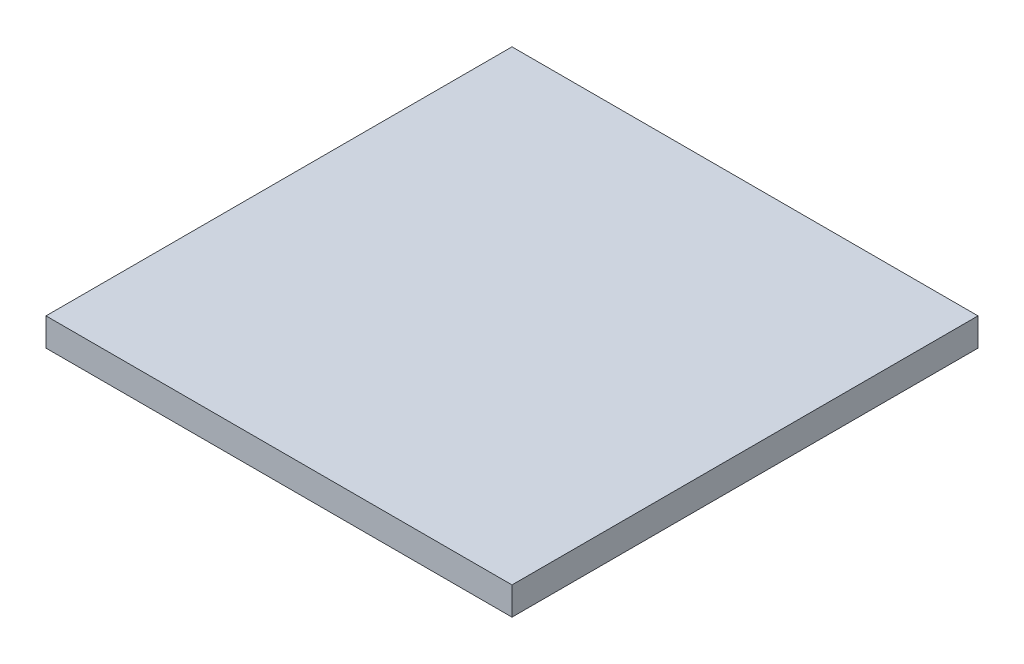
ISO-10303-21;
HEADER;
FILE_DESCRIPTION(('STEP AP214'),'2;1');
FILE_NAME('part.step','',(''),(''),'','','');
FILE_SCHEMA(('AUTOMOTIVE_DESIGN { 1 0 10303 214 1 1 1 1 }'));
ENDSEC;
DATA;
#1=APPLICATION_CONTEXT('core data for automotive mechanical design processes');
#2=APPLICATION_PROTOCOL_DEFINITION('international standard','automotive_design',2000,#1);
#3=PRODUCT_CONTEXT('',#1,'mechanical');
#4=PRODUCT('Part','Part','',(#3));
#5=PRODUCT_RELATED_PRODUCT_CATEGORY('part','',(#4));
#6=PRODUCT_DEFINITION_FORMATION('','',#4);
#7=PRODUCT_DEFINITION_CONTEXT('part definition',#1,'design');
#8=PRODUCT_DEFINITION('design','',#6,#7);
#9=PRODUCT_DEFINITION_SHAPE('','',#8);
#10=(LENGTH_UNIT() NAMED_UNIT(*) SI_UNIT(.MILLI.,.METRE.));
#11=(NAMED_UNIT(*) PLANE_ANGLE_UNIT() SI_UNIT($,.RADIAN.));
#12=(NAMED_UNIT(*) SI_UNIT($,.STERADIAN.) SOLID_ANGLE_UNIT());
#13=UNCERTAINTY_MEASURE_WITH_UNIT(LENGTH_MEASURE(1.E-05),#10,'distance_accuracy_value','');
#14=(GEOMETRIC_REPRESENTATION_CONTEXT(3) GLOBAL_UNCERTAINTY_ASSIGNED_CONTEXT((#13)) GLOBAL_UNIT_ASSIGNED_CONTEXT((#10,
#11,#12)) REPRESENTATION_CONTEXT('',''));
#15=CARTESIAN_POINT('',(0.,0.,0.));
#16=DIRECTION('',(0.,0.,1.));
#17=DIRECTION('',(1.,0.,0.));
#18=AXIS2_PLACEMENT_3D('',#15,#16,#17);
#19=CARTESIAN_POINT('',(-250.,30.,-250.));
#20=DIRECTION('',(1.,0.,0.));
#21=DIRECTION('',(0.,0.,-1.));
#22=AXIS2_PLACEMENT_3D('',#19,#20,#21);
#23=PLANE('',#22);
#24=DIRECTION('',(0.,0.,1.));
#25=VECTOR('',#24,1.);
#26=CARTESIAN_POINT('',(-250.,0.,-250.));
#27=LINE('',#26,#25);
#28=CARTESIAN_POINT('',(-250.,0.,-250.));
#29=VERTEX_POINT('',#28);
#30=CARTESIAN_POINT('',(-250.,0.,250.));
#31=VERTEX_POINT('',#30);
#32=EDGE_CURVE('E96',#29,#31,#27,.T.);
#33=ORIENTED_EDGE('',*,*,#32,.T.);
#34=DIRECTION('',(0.,-1.,0.));
#35=VECTOR('',#34,1.);
#36=CARTESIAN_POINT('',(-250.,30.,250.));
#37=LINE('',#36,#35);
#38=CARTESIAN_POINT('',(-250.,30.,250.));
#39=VERTEX_POINT('',#38);
#40=EDGE_CURVE('E11',#39,#31,#37,.T.);
#41=ORIENTED_EDGE('',*,*,#40,.F.);
#42=DIRECTION('',(0.,0.,1.));
#43=VECTOR('',#42,1.);
#44=CARTESIAN_POINT('',(-250.,30.,-250.));
#45=LINE('',#44,#43);
#46=CARTESIAN_POINT('',(-250.,30.,-250.));
#47=VERTEX_POINT('',#46);
#48=EDGE_CURVE('E84',#47,#39,#45,.T.);
#49=ORIENTED_EDGE('',*,*,#48,.F.);
#50=DIRECTION('',(0.,-1.,0.));
#51=VECTOR('',#50,1.);
#52=CARTESIAN_POINT('',(-250.,30.,-250.));
#53=LINE('',#52,#51);
#54=EDGE_CURVE('E92',#47,#29,#53,.T.);
#55=ORIENTED_EDGE('',*,*,#54,.T.);
#56=EDGE_LOOP('',(#33,#41,#49,#55));
#57=FACE_BOUND('',#56,.T.);
#58=ADVANCED_FACE('F33',(#57),#23,.F.);
#59=CARTESIAN_POINT('',(-250.,30.,250.));
#60=DIRECTION('',(0.,0.,-1.));
#61=DIRECTION('',(-1.,0.,0.));
#62=AXIS2_PLACEMENT_3D('',#59,#60,#61);
#63=PLANE('',#62);
#64=DIRECTION('',(1.,0.,0.));
#65=VECTOR('',#64,1.);
#66=CARTESIAN_POINT('',(-250.,0.,250.));
#67=LINE('',#66,#65);
#68=CARTESIAN_POINT('',(250.,0.,250.));
#69=VERTEX_POINT('',#68);
#70=EDGE_CURVE('E88',#31,#69,#67,.T.);
#71=ORIENTED_EDGE('',*,*,#70,.T.);
#72=DIRECTION('',(0.,-1.,0.));
#73=VECTOR('',#72,1.);
#74=CARTESIAN_POINT('',(250.,30.,250.));
#75=LINE('',#74,#73);
#76=CARTESIAN_POINT('',(250.,30.,250.));
#77=VERTEX_POINT('',#76);
#78=EDGE_CURVE('E41',#77,#69,#75,.T.);
#79=ORIENTED_EDGE('',*,*,#78,.F.);
#80=DIRECTION('',(1.,0.,0.));
#81=VECTOR('',#80,1.);
#82=CARTESIAN_POINT('',(-250.,30.,250.));
#83=LINE('',#82,#81);
#84=EDGE_CURVE('E79',#39,#77,#83,.T.);
#85=ORIENTED_EDGE('',*,*,#84,.F.);
#86=ORIENTED_EDGE('',*,*,#40,.T.);
#87=EDGE_LOOP('',(#71,#79,#85,#86));
#88=FACE_BOUND('',#87,.T.);
#89=ADVANCED_FACE('F87',(#88),#63,.F.);
#90=CARTESIAN_POINT('',(250.,30.,-250.));
#91=DIRECTION('',(-1.,0.,0.));
#92=DIRECTION('',(0.,0.,1.));
#93=AXIS2_PLACEMENT_3D('',#90,#91,#92);
#94=PLANE('',#93);
#95=DIRECTION('',(0.,0.,-1.));
#96=VECTOR('',#95,1.);
#97=CARTESIAN_POINT('',(250.,0.,-250.));
#98=LINE('',#97,#96);
#99=CARTESIAN_POINT('',(250.,0.,-250.));
#100=VERTEX_POINT('',#99);
#101=EDGE_CURVE('E66',#69,#100,#98,.T.);
#102=ORIENTED_EDGE('',*,*,#101,.T.);
#103=DIRECTION('',(0.,-1.,0.));
#104=VECTOR('',#103,1.);
#105=CARTESIAN_POINT('',(250.,30.,-250.));
#106=LINE('',#105,#104);
#107=CARTESIAN_POINT('',(250.,30.,-250.));
#108=VERTEX_POINT('',#107);
#109=EDGE_CURVE('E89',#108,#100,#106,.T.);
#110=ORIENTED_EDGE('',*,*,#109,.F.);
#111=DIRECTION('',(0.,0.,-1.));
#112=VECTOR('',#111,1.);
#113=CARTESIAN_POINT('',(250.,30.,-250.));
#114=LINE('',#113,#112);
#115=EDGE_CURVE('E82',#77,#108,#114,.T.);
#116=ORIENTED_EDGE('',*,*,#115,.F.);
#117=ORIENTED_EDGE('',*,*,#78,.T.);
#118=EDGE_LOOP('',(#102,#110,#116,#117));
#119=FACE_BOUND('',#118,.T.);
#120=ADVANCED_FACE('F90',(#119),#94,.F.);
#121=CARTESIAN_POINT('',(-250.,30.,-250.));
#122=DIRECTION('',(0.,0.,1.));
#123=DIRECTION('',(1.,0.,0.));
#124=AXIS2_PLACEMENT_3D('',#121,#122,#123);
#125=PLANE('',#124);
#126=DIRECTION('',(-1.,0.,0.));
#127=VECTOR('',#126,1.);
#128=CARTESIAN_POINT('',(-250.,0.,-250.));
#129=LINE('',#128,#127);
#130=EDGE_CURVE('E72',#100,#29,#129,.T.);
#131=ORIENTED_EDGE('',*,*,#130,.T.);
#132=ORIENTED_EDGE('',*,*,#54,.F.);
#133=DIRECTION('',(-1.,0.,0.));
#134=VECTOR('',#133,1.);
#135=CARTESIAN_POINT('',(-250.,30.,-250.));
#136=LINE('',#135,#134);
#137=EDGE_CURVE('E49',#108,#47,#136,.T.);
#138=ORIENTED_EDGE('',*,*,#137,.F.);
#139=ORIENTED_EDGE('',*,*,#109,.T.);
#140=EDGE_LOOP('',(#131,#132,#138,#139));
#141=FACE_BOUND('',#140,.T.);
#142=ADVANCED_FACE('F103',(#141),#125,.F.);
#143=CARTESIAN_POINT('',(0.,30.,0.));
#144=DIRECTION('',(0.,1.,0.));
#145=DIRECTION('',(0.,0.,1.));
#146=AXIS2_PLACEMENT_3D('',#143,#144,#145);
#147=PLANE('',#146);
#148=ORIENTED_EDGE('',*,*,#48,.T.);
#149=ORIENTED_EDGE('',*,*,#84,.T.);
#150=ORIENTED_EDGE('',*,*,#115,.T.);
#151=ORIENTED_EDGE('',*,*,#137,.T.);
#152=EDGE_LOOP('',(#148,#149,#150,#151));
#153=FACE_BOUND('',#152,.T.);
#154=ADVANCED_FACE('F80',(#153),#147,.T.);
#155=CARTESIAN_POINT('',(0.,0.,0.));
#156=DIRECTION('',(0.,1.,0.));
#157=DIRECTION('',(0.,0.,1.));
#158=AXIS2_PLACEMENT_3D('',#155,#156,#157);
#159=PLANE('',#158);
#160=ORIENTED_EDGE('',*,*,#32,.F.);
#161=ORIENTED_EDGE('',*,*,#130,.F.);
#162=ORIENTED_EDGE('',*,*,#101,.F.);
#163=ORIENTED_EDGE('',*,*,#70,.F.);
#164=EDGE_LOOP('',(#160,#161,#162,#163));
#165=FACE_BOUND('',#164,.T.);
#166=ADVANCED_FACE('F106',(#165),#159,.F.);
#167=CLOSED_SHELL('',(#58,#89,#120,#142,#154,#166));
#168=MANIFOLD_SOLID_BREP('B2',#167);
#169=ADVANCED_BREP_SHAPE_REPRESENTATION('',(#18,#168),#14);
#170=SHAPE_DEFINITION_REPRESENTATION(#9,#169);
ENDSEC;
END-ISO-10303-21;
